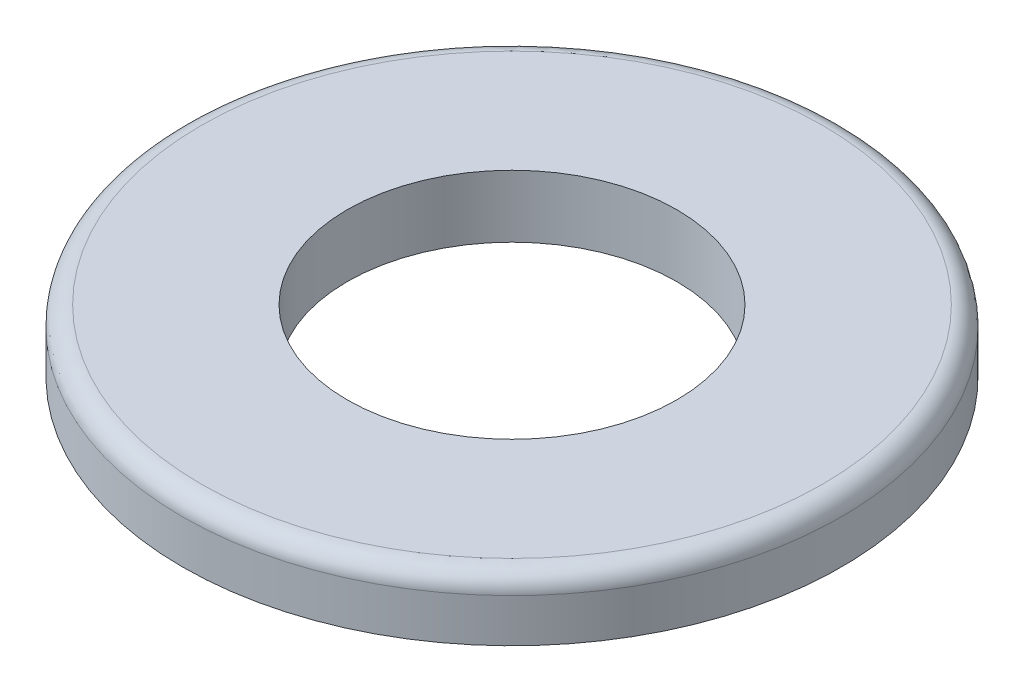
ISO-10303-21;
HEADER;
FILE_DESCRIPTION(('STEP AP214'),'2;1');
FILE_NAME('part.step','',(''),(''),'','','');
FILE_SCHEMA(('AUTOMOTIVE_DESIGN { 1 0 10303 214 1 1 1 1 }'));
ENDSEC;
DATA;
#1=APPLICATION_CONTEXT('core data for automotive mechanical design processes');
#2=APPLICATION_PROTOCOL_DEFINITION('international standard','automotive_design',2000,#1);
#3=PRODUCT_CONTEXT('',#1,'mechanical');
#4=PRODUCT('Part','Part','',(#3));
#5=PRODUCT_RELATED_PRODUCT_CATEGORY('part','',(#4));
#6=PRODUCT_DEFINITION_FORMATION('','',#4);
#7=PRODUCT_DEFINITION_CONTEXT('part definition',#1,'design');
#8=PRODUCT_DEFINITION('design','',#6,#7);
#9=PRODUCT_DEFINITION_SHAPE('','',#8);
#10=(LENGTH_UNIT() NAMED_UNIT(*) SI_UNIT(.MILLI.,.METRE.));
#11=(NAMED_UNIT(*) PLANE_ANGLE_UNIT() SI_UNIT($,.RADIAN.));
#12=(NAMED_UNIT(*) SI_UNIT($,.STERADIAN.) SOLID_ANGLE_UNIT());
#13=UNCERTAINTY_MEASURE_WITH_UNIT(LENGTH_MEASURE(1.E-05),#10,'distance_accuracy_value','');
#14=(GEOMETRIC_REPRESENTATION_CONTEXT(3) GLOBAL_UNCERTAINTY_ASSIGNED_CONTEXT((#13)) GLOBAL_UNIT_ASSIGNED_CONTEXT((#10,
#11,#12)) REPRESENTATION_CONTEXT('',''));
#15=CARTESIAN_POINT('',(0.,0.,0.));
#16=DIRECTION('',(0.,0.,1.));
#17=DIRECTION('',(1.,0.,0.));
#18=AXIS2_PLACEMENT_3D('',#15,#16,#17);
#19=CARTESIAN_POINT('',(0.,1.651,0.));
#20=DIRECTION('',(0.,1.,0.));
#21=DIRECTION('',(0.,0.,1.));
#22=AXIS2_PLACEMENT_3D('',#19,#20,#21);
#23=PLANE('',#22);
#24=CARTESIAN_POINT('',(0.,1.651,0.));
#25=DIRECTION('',(0.,1.,0.));
#26=DIRECTION('',(0.,0.,1.));
#27=AXIS2_PLACEMENT_3D('',#24,#25,#26);
#28=CIRCLE('',#27,8.23125);
#29=CARTESIAN_POINT('',(0.,1.651,8.23125));
#30=VERTEX_POINT('',#29);
#31=EDGE_CURVE('E42',#30,#30,#28,.T.);
#32=ORIENTED_EDGE('',*,*,#31,.T.);
#33=EDGE_LOOP('',(#32));
#34=FACE_BOUND('',#33,.T.);
#35=CARTESIAN_POINT('',(0.,1.651,0.));
#36=DIRECTION('',(0.,1.,0.));
#37=DIRECTION('',(0.,0.,1.));
#38=AXIS2_PLACEMENT_3D('',#35,#36,#37);
#39=CIRCLE('',#38,4.365625);
#40=CARTESIAN_POINT('',(0.,1.651,-4.365625));
#41=VERTEX_POINT('',#40);
#42=EDGE_CURVE('E50',#41,#41,#39,.T.);
#43=ORIENTED_EDGE('',*,*,#42,.F.);
#44=EDGE_LOOP('',(#43));
#45=FACE_BOUND('',#44,.T.);
#46=ADVANCED_FACE('F35',(#34,#45),#23,.T.);
#47=CARTESIAN_POINT('',(0.,0.,0.));
#48=DIRECTION('',(0.,1.,0.));
#49=DIRECTION('',(0.,0.,1.));
#50=AXIS2_PLACEMENT_3D('',#47,#48,#49);
#51=PLANE('',#50);
#52=CARTESIAN_POINT('',(0.,0.,0.));
#53=DIRECTION('',(0.,1.,0.));
#54=DIRECTION('',(0.,0.,1.));
#55=AXIS2_PLACEMENT_3D('',#52,#53,#54);
#56=CIRCLE('',#55,8.73125);
#57=CARTESIAN_POINT('',(0.,0.,-8.73125));
#58=VERTEX_POINT('',#57);
#59=EDGE_CURVE('E46',#58,#58,#56,.T.);
#60=ORIENTED_EDGE('',*,*,#59,.F.);
#61=EDGE_LOOP('',(#60));
#62=FACE_BOUND('',#61,.T.);
#63=CARTESIAN_POINT('',(0.,0.,0.));
#64=DIRECTION('',(0.,1.,0.));
#65=DIRECTION('',(0.,0.,1.));
#66=AXIS2_PLACEMENT_3D('',#63,#64,#65);
#67=CIRCLE('',#66,4.365625);
#68=CARTESIAN_POINT('',(0.,0.,-4.365625));
#69=VERTEX_POINT('',#68);
#70=EDGE_CURVE('E53',#69,#69,#67,.T.);
#71=ORIENTED_EDGE('',*,*,#70,.T.);
#72=EDGE_LOOP('',(#71));
#73=FACE_BOUND('',#72,.T.);
#74=ADVANCED_FACE('F63',(#62,#73),#51,.F.);
#75=CARTESIAN_POINT('',(0.,1.651,0.));
#76=DIRECTION('',(0.,-1.,0.));
#77=DIRECTION('',(0.,0.,-1.));
#78=AXIS2_PLACEMENT_3D('',#75,#76,#77);
#79=CYLINDRICAL_SURFACE('',#78,8.73125);
#80=CARTESIAN_POINT('',(0.,1.151,0.));
#81=DIRECTION('',(0.,1.,0.));
#82=DIRECTION('',(0.,0.,1.));
#83=AXIS2_PLACEMENT_3D('',#80,#81,#82);
#84=CIRCLE('',#83,8.73125);
#85=CARTESIAN_POINT('',(0.,1.151,-8.73125));
#86=VERTEX_POINT('',#85);
#87=EDGE_CURVE('E10',#86,#86,#84,.F.);
#88=CARTESIAN_POINT('',(0.,1.151,-8.73125));
#89=CARTESIAN_POINT('',(0.,1.13901041666667,-8.73125));
#90=CARTESIAN_POINT('',(0.,1.12702083333333,-8.73125));
#91=CARTESIAN_POINT('',(0.,1.10304166666667,-8.73125));
#92=CARTESIAN_POINT('',(0.,1.09105208333333,-8.73125));
#93=CARTESIAN_POINT('',(0.,1.06707291666667,-8.73125));
#94=CARTESIAN_POINT('',(0.,1.05508333333333,-8.73125));
#95=CARTESIAN_POINT('',(0.,1.03110416666667,-8.73125));
#96=CARTESIAN_POINT('',(0.,1.01911458333333,-8.73125));
#97=CARTESIAN_POINT('',(0.,0.995135416666666,-8.73125));
#98=CARTESIAN_POINT('',(0.,0.983145833333333,-8.73125));
#99=CARTESIAN_POINT('',(0.,0.959166666666666,-8.73125));
#100=CARTESIAN_POINT('',(0.,0.947177083333333,-8.73125));
#101=CARTESIAN_POINT('',(0.,0.923197916666667,-8.73125));
#102=CARTESIAN_POINT('',(0.,0.911208333333333,-8.73125));
#103=CARTESIAN_POINT('',(0.,0.887229166666666,-8.73125));
#104=CARTESIAN_POINT('',(0.,0.875239583333333,-8.73125));
#105=CARTESIAN_POINT('',(0.,0.851260416666666,-8.73125));
#106=CARTESIAN_POINT('',(0.,0.839270833333333,-8.73125));
#107=CARTESIAN_POINT('',(0.,0.815291666666666,-8.73125));
#108=CARTESIAN_POINT('',(0.,0.803302083333333,-8.73125));
#109=CARTESIAN_POINT('',(0.,0.779322916666666,-8.73125));
#110=CARTESIAN_POINT('',(0.,0.767333333333333,-8.73125));
#111=CARTESIAN_POINT('',(0.,0.743354166666666,-8.73125));
#112=CARTESIAN_POINT('',(0.,0.731364583333333,-8.73125));
#113=CARTESIAN_POINT('',(0.,0.707385416666667,-8.73125));
#114=CARTESIAN_POINT('',(0.,0.695395833333333,-8.73125));
#115=CARTESIAN_POINT('',(0.,0.671416666666667,-8.73125));
#116=CARTESIAN_POINT('',(0.,0.659427083333333,-8.73125));
#117=CARTESIAN_POINT('',(0.,0.635447916666667,-8.73125));
#118=CARTESIAN_POINT('',(0.,0.623458333333333,-8.73125));
#119=CARTESIAN_POINT('',(0.,0.599479166666667,-8.73125));
#120=CARTESIAN_POINT('',(0.,0.587489583333333,-8.73125));
#121=CARTESIAN_POINT('',(0.,0.563510416666667,-8.73125));
#122=CARTESIAN_POINT('',(0.,0.551520833333333,-8.73125));
#123=CARTESIAN_POINT('',(0.,0.527541666666667,-8.73125));
#124=CARTESIAN_POINT('',(0.,0.515552083333333,-8.73125));
#125=CARTESIAN_POINT('',(0.,0.491572916666667,-8.73125));
#126=CARTESIAN_POINT('',(0.,0.479583333333333,-8.73125));
#127=CARTESIAN_POINT('',(0.,0.455604166666667,-8.73125));
#128=CARTESIAN_POINT('',(0.,0.443614583333333,-8.73125));
#129=CARTESIAN_POINT('',(0.,0.419635416666667,-8.73125));
#130=CARTESIAN_POINT('',(0.,0.407645833333333,-8.73125));
#131=CARTESIAN_POINT('',(0.,0.383666666666667,-8.73125));
#132=CARTESIAN_POINT('',(0.,0.371677083333333,-8.73125));
#133=CARTESIAN_POINT('',(0.,0.347697916666667,-8.73125));
#134=CARTESIAN_POINT('',(0.,0.335708333333333,-8.73125));
#135=CARTESIAN_POINT('',(0.,0.311729166666667,-8.73125));
#136=CARTESIAN_POINT('',(0.,0.299739583333333,-8.73125));
#137=CARTESIAN_POINT('',(0.,0.275760416666667,-8.73125));
#138=CARTESIAN_POINT('',(0.,0.263770833333333,-8.73125));
#139=CARTESIAN_POINT('',(0.,0.239791666666667,-8.73125));
#140=CARTESIAN_POINT('',(0.,0.227802083333333,-8.73125));
#141=CARTESIAN_POINT('',(0.,0.203822916666667,-8.73125));
#142=CARTESIAN_POINT('',(0.,0.191833333333333,-8.73125));
#143=CARTESIAN_POINT('',(0.,0.167854166666667,-8.73125));
#144=CARTESIAN_POINT('',(0.,0.155864583333333,-8.73125));
#145=CARTESIAN_POINT('',(0.,0.131885416666667,-8.73125));
#146=CARTESIAN_POINT('',(0.,0.119895833333333,-8.73125));
#147=CARTESIAN_POINT('',(0.,0.0959166666666666,-8.73125));
#148=CARTESIAN_POINT('',(0.,0.0839270833333333,-8.73125));
#149=CARTESIAN_POINT('',(0.,0.0599479166666666,-8.73125));
#150=CARTESIAN_POINT('',(0.,0.0479583333333333,-8.73125));
#151=CARTESIAN_POINT('',(0.,0.0239791666666667,-8.73125));
#152=CARTESIAN_POINT('',(0.,0.0119895833333333,-8.73125));
#153=CARTESIAN_POINT('',(0.,0.,-8.73125));
#154=B_SPLINE_CURVE_WITH_KNOTS('',3,(#88,#89,#90,#91,#92,#93,#94,#95,#96,#97,#98,#99,#100,#101,
#102,#103,#104,#105,#106,#107,#108,#109,#110,#111,#112,#113,#114,#115,#116,#117,#118,#119,#120,
#121,#122,#123,#124,#125,#126,#127,#128,#129,#130,#131,#132,#133,#134,#135,#136,#137,#138,#139,
#140,#141,#142,#143,#144,#145,#146,#147,#148,#149,#150,#151,#152,#153),.UNSPECIFIED.,.F.,.F.,(4,
2,2,2,2,2,2,2,2,2,2,2,2,2,2,2,2,2,2,2,2,2,2,2,2,2,2,2,2,2,2,2,4),(0.,0.03596875,0.0719375,
0.10790625,0.143875,0.17984375,0.2158125,0.25178125,0.28775,0.32371875,0.3596875,0.39565625,
0.431625,0.46759375,0.5035625,0.53953125,0.5755,0.61146875,0.6474375,0.68340625,0.719375,
0.75534375,0.7913125,0.82728125,0.86325,0.89921875,0.9351875,0.97115625,1.007125,1.04309375,
1.0790625,1.11503125,1.151),.UNSPECIFIED.);
#155=EDGE_CURVE('BSEAM68',#86,#58,#154,.T.);
#156=ORIENTED_EDGE('',*,*,#87,.T.);
#157=ORIENTED_EDGE('',*,*,#59,.T.);
#158=ORIENTED_EDGE('',*,*,#155,.T.);
#159=ORIENTED_EDGE('',*,*,#155,.F.);
#160=EDGE_LOOP('',(#156,#158,#157,#159));
#161=FACE_BOUND('',#160,.T.);
#162=ADVANCED_FACE('F68',(#161),#79,.T.);
#163=CARTESIAN_POINT('',(0.,1.651,0.));
#164=DIRECTION('',(0.,-1.,0.));
#165=DIRECTION('',(0.,0.,-1.));
#166=AXIS2_PLACEMENT_3D('',#163,#164,#165);
#167=CYLINDRICAL_SURFACE('',#166,4.365625);
#168=CARTESIAN_POINT('',(0.,1.651,-4.365625));
#169=CARTESIAN_POINT('',(0.,1.63380208333333,-4.365625));
#170=CARTESIAN_POINT('',(0.,1.61660416666667,-4.365625));
#171=CARTESIAN_POINT('',(0.,1.58220833333333,-4.365625));
#172=CARTESIAN_POINT('',(0.,1.56501041666667,-4.365625));
#173=CARTESIAN_POINT('',(0.,1.53061458333333,-4.365625));
#174=CARTESIAN_POINT('',(0.,1.51341666666667,-4.365625));
#175=CARTESIAN_POINT('',(0.,1.47902083333333,-4.365625));
#176=CARTESIAN_POINT('',(0.,1.46182291666667,-4.365625));
#177=CARTESIAN_POINT('',(0.,1.42742708333333,-4.365625));
#178=CARTESIAN_POINT('',(0.,1.41022916666667,-4.365625));
#179=CARTESIAN_POINT('',(0.,1.37583333333333,-4.365625));
#180=CARTESIAN_POINT('',(0.,1.35863541666667,-4.365625));
#181=CARTESIAN_POINT('',(0.,1.32423958333333,-4.365625));
#182=CARTESIAN_POINT('',(0.,1.30704166666667,-4.365625));
#183=CARTESIAN_POINT('',(0.,1.27264583333333,-4.365625));
#184=CARTESIAN_POINT('',(0.,1.25544791666667,-4.365625));
#185=CARTESIAN_POINT('',(0.,1.22105208333333,-4.365625));
#186=CARTESIAN_POINT('',(0.,1.20385416666667,-4.365625));
#187=CARTESIAN_POINT('',(0.,1.16945833333333,-4.365625));
#188=CARTESIAN_POINT('',(0.,1.15226041666667,-4.365625));
#189=CARTESIAN_POINT('',(0.,1.11786458333333,-4.365625));
#190=CARTESIAN_POINT('',(0.,1.10066666666667,-4.365625));
#191=CARTESIAN_POINT('',(0.,1.06627083333333,-4.365625));
#192=CARTESIAN_POINT('',(0.,1.04907291666667,-4.365625));
#193=CARTESIAN_POINT('',(0.,1.01467708333333,-4.365625));
#194=CARTESIAN_POINT('',(0.,0.997479166666666,-4.365625));
#195=CARTESIAN_POINT('',(0.,0.963083333333333,-4.365625));
#196=CARTESIAN_POINT('',(0.,0.945885416666666,-4.365625));
#197=CARTESIAN_POINT('',(0.,0.911489583333333,-4.365625));
#198=CARTESIAN_POINT('',(0.,0.894291666666666,-4.365625));
#199=CARTESIAN_POINT('',(0.,0.859895833333333,-4.365625));
#200=CARTESIAN_POINT('',(0.,0.842697916666666,-4.365625));
#201=CARTESIAN_POINT('',(0.,0.808302083333333,-4.365625));
#202=CARTESIAN_POINT('',(0.,0.791104166666666,-4.365625));
#203=CARTESIAN_POINT('',(0.,0.756708333333333,-4.365625));
#204=CARTESIAN_POINT('',(0.,0.739510416666667,-4.365625));
#205=CARTESIAN_POINT('',(0.,0.705114583333333,-4.365625));
#206=CARTESIAN_POINT('',(0.,0.687916666666667,-4.365625));
#207=CARTESIAN_POINT('',(0.,0.653520833333333,-4.365625));
#208=CARTESIAN_POINT('',(0.,0.636322916666667,-4.365625));
#209=CARTESIAN_POINT('',(0.,0.601927083333333,-4.365625));
#210=CARTESIAN_POINT('',(0.,0.584729166666667,-4.365625));
#211=CARTESIAN_POINT('',(0.,0.550333333333333,-4.365625));
#212=CARTESIAN_POINT('',(0.,0.533135416666667,-4.365625));
#213=CARTESIAN_POINT('',(0.,0.498739583333333,-4.365625));
#214=CARTESIAN_POINT('',(0.,0.481541666666667,-4.365625));
#215=CARTESIAN_POINT('',(0.,0.447145833333333,-4.365625));
#216=CARTESIAN_POINT('',(0.,0.429947916666667,-4.365625));
#217=CARTESIAN_POINT('',(0.,0.395552083333333,-4.365625));
#218=CARTESIAN_POINT('',(0.,0.378354166666667,-4.365625));
#219=CARTESIAN_POINT('',(0.,0.343958333333333,-4.365625));
#220=CARTESIAN_POINT('',(0.,0.326760416666667,-4.365625));
#221=CARTESIAN_POINT('',(0.,0.292364583333333,-4.365625));
#222=CARTESIAN_POINT('',(0.,0.275166666666667,-4.365625));
#223=CARTESIAN_POINT('',(0.,0.240770833333333,-4.365625));
#224=CARTESIAN_POINT('',(0.,0.223572916666667,-4.365625));
#225=CARTESIAN_POINT('',(0.,0.189177083333333,-4.365625));
#226=CARTESIAN_POINT('',(0.,0.171979166666667,-4.365625));
#227=CARTESIAN_POINT('',(0.,0.137583333333333,-4.365625));
#228=CARTESIAN_POINT('',(0.,0.120385416666667,-4.365625));
#229=CARTESIAN_POINT('',(0.,0.0859895833333333,-4.365625));
#230=CARTESIAN_POINT('',(0.,0.0687916666666667,-4.365625));
#231=CARTESIAN_POINT('',(0.,0.0343958333333333,-4.365625));
#232=CARTESIAN_POINT('',(0.,0.0171979166666666,-4.365625));
#233=CARTESIAN_POINT('',(0.,0.,-4.365625));
#234=B_SPLINE_CURVE_WITH_KNOTS('',3,(#168,#169,#170,#171,#172,#173,#174,#175,#176,#177,#178,
#179,#180,#181,#182,#183,#184,#185,#186,#187,#188,#189,#190,#191,#192,#193,#194,#195,#196,#197,
#198,#199,#200,#201,#202,#203,#204,#205,#206,#207,#208,#209,#210,#211,#212,#213,#214,#215,#216,
#217,#218,#219,#220,#221,#222,#223,#224,#225,#226,#227,#228,#229,#230,#231,#232,#233),
.UNSPECIFIED.,.F.,.F.,(4,2,2,2,2,2,2,2,2,2,2,2,2,2,2,2,2,2,2,2,2,2,2,2,2,2,2,2,2,2,2,2,4),(0.,
0.0515937500000002,0.1031875,0.15478125,0.206375,0.25796875,0.3095625,0.36115625,0.41275,
0.46434375,0.5159375,0.56753125,0.619125,0.67071875,0.7223125,0.77390625,0.8255,0.87709375,
0.9286875,0.98028125,1.031875,1.08346875,1.1350625,1.18665625,1.23825,1.28984375,1.3414375,
1.39303125,1.444625,1.49621875,1.5478125,1.59940625,1.651),.UNSPECIFIED.);
#235=EDGE_CURVE('BSEAM59',#41,#69,#234,.T.);
#236=ORIENTED_EDGE('',*,*,#42,.T.);
#237=ORIENTED_EDGE('',*,*,#70,.F.);
#238=ORIENTED_EDGE('',*,*,#235,.T.);
#239=ORIENTED_EDGE('',*,*,#235,.F.);
#240=EDGE_LOOP('',(#236,#238,#237,#239));
#241=FACE_BOUND('',#240,.T.);
#242=ADVANCED_FACE('F59',(#241),#167,.F.);
#243=CARTESIAN_POINT('',(0.,1.151,0.));
#244=DIRECTION('',(0.,1.,0.));
#245=DIRECTION('',(0.,0.,1.));
#246=AXIS2_PLACEMENT_3D('',#243,#244,#245);
#247=TOROIDAL_SURFACE('',#246,8.23125,0.5);
#248=ORIENTED_EDGE('',*,*,#87,.F.);
#249=EDGE_LOOP('',(#248));
#250=FACE_BOUND('',#249,.T.);
#251=ORIENTED_EDGE('',*,*,#31,.F.);
#252=EDGE_LOOP('',(#251));
#253=FACE_BOUND('',#252,.T.);
#254=ADVANCED_FACE('F37',(#250,#253),#247,.T.);
#255=CLOSED_SHELL('',(#46,#74,#162,#242,#254));
#256=MANIFOLD_SOLID_BREP('B2',#255);
#257=ADVANCED_BREP_SHAPE_REPRESENTATION('',(#18,#256),#14);
#258=SHAPE_DEFINITION_REPRESENTATION(#9,#257);
ENDSEC;
END-ISO-10303-21;
